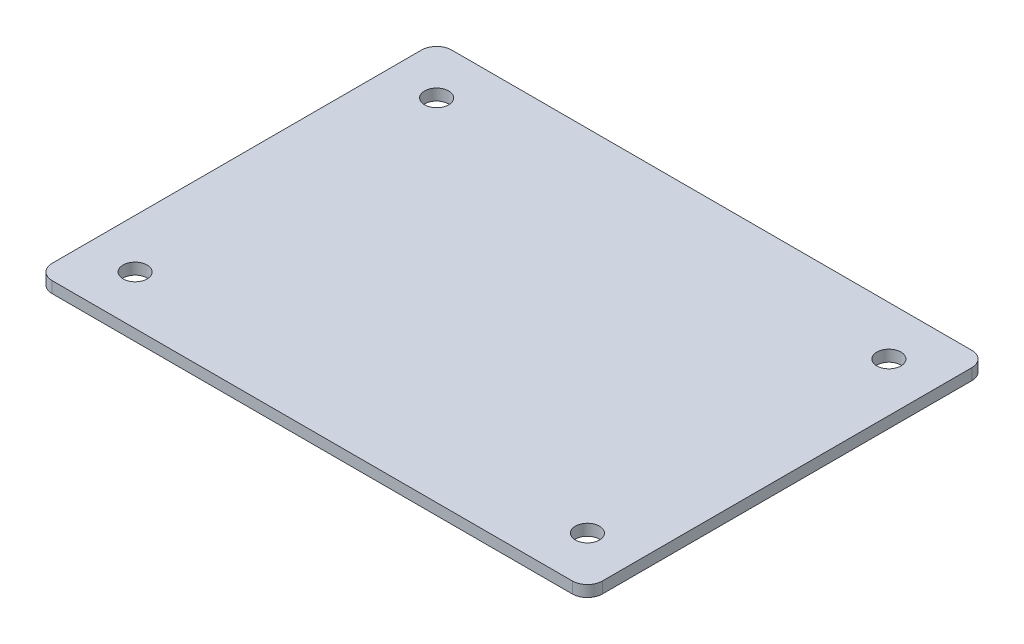
ISO-10303-21;
HEADER;
FILE_DESCRIPTION(('STEP AP214'),'2;1');
FILE_NAME('part.step','',(''),(''),'','','');
FILE_SCHEMA(('AUTOMOTIVE_DESIGN { 1 0 10303 214 1 1 1 1 }'));
ENDSEC;
DATA;
#1=APPLICATION_CONTEXT('core data for automotive mechanical design processes');
#2=APPLICATION_PROTOCOL_DEFINITION('international standard','automotive_design',2000,#1);
#3=PRODUCT_CONTEXT('',#1,'mechanical');
#4=PRODUCT('Part','Part','',(#3));
#5=PRODUCT_RELATED_PRODUCT_CATEGORY('part','',(#4));
#6=PRODUCT_DEFINITION_FORMATION('','',#4);
#7=PRODUCT_DEFINITION_CONTEXT('part definition',#1,'design');
#8=PRODUCT_DEFINITION('design','',#6,#7);
#9=PRODUCT_DEFINITION_SHAPE('','',#8);
#10=(LENGTH_UNIT() NAMED_UNIT(*) SI_UNIT(.MILLI.,.METRE.));
#11=(NAMED_UNIT(*) PLANE_ANGLE_UNIT() SI_UNIT($,.RADIAN.));
#12=(NAMED_UNIT(*) SI_UNIT($,.STERADIAN.) SOLID_ANGLE_UNIT());
#13=UNCERTAINTY_MEASURE_WITH_UNIT(LENGTH_MEASURE(1.E-05),#10,'distance_accuracy_value','');
#14=(GEOMETRIC_REPRESENTATION_CONTEXT(3) GLOBAL_UNCERTAINTY_ASSIGNED_CONTEXT((#13)) GLOBAL_UNIT_ASSIGNED_CONTEXT((#10,
#11,#12)) REPRESENTATION_CONTEXT('',''));
#15=CARTESIAN_POINT('',(0.,0.,0.));
#16=DIRECTION('',(0.,0.,1.));
#17=DIRECTION('',(1.,0.,0.));
#18=AXIS2_PLACEMENT_3D('',#15,#16,#17);
#19=CARTESIAN_POINT('',(30.,0.,20.));
#20=DIRECTION('',(0.,1.,0.));
#21=DIRECTION('',(0.,0.,1.));
#22=AXIS2_PLACEMENT_3D('',#19,#20,#21);
#23=CYLINDRICAL_SURFACE('',#22,1.6);
#24=CARTESIAN_POINT('',(30.,0.,20.));
#25=DIRECTION('',(0.,1.,0.));
#26=DIRECTION('',(0.,0.,1.));
#27=AXIS2_PLACEMENT_3D('',#24,#25,#26);
#28=CIRCLE('',#27,1.6);
#29=CARTESIAN_POINT('',(30.,0.,21.6));
#30=VERTEX_POINT('',#29);
#31=EDGE_CURVE('E42',#30,#30,#28,.T.);
#32=ORIENTED_EDGE('',*,*,#31,.F.);
#33=EDGE_LOOP('',(#32));
#34=FACE_BOUND('',#33,.T.);
#35=CARTESIAN_POINT('',(30.,1.5,20.));
#36=DIRECTION('',(0.,1.,0.));
#37=DIRECTION('',(0.,0.,1.));
#38=AXIS2_PLACEMENT_3D('',#35,#36,#37);
#39=CIRCLE('',#38,1.6);
#40=CARTESIAN_POINT('',(30.,1.5,21.6));
#41=VERTEX_POINT('',#40);
#42=EDGE_CURVE('E11',#41,#41,#39,.T.);
#43=ORIENTED_EDGE('',*,*,#42,.T.);
#44=EDGE_LOOP('',(#43));
#45=FACE_BOUND('',#44,.T.);
#46=ADVANCED_FACE('F35',(#34,#45),#23,.F.);
#47=CARTESIAN_POINT('',(-30.,0.,20.));
#48=DIRECTION('',(0.,1.,0.));
#49=DIRECTION('',(0.,0.,1.));
#50=AXIS2_PLACEMENT_3D('',#47,#48,#49);
#51=CYLINDRICAL_SURFACE('',#50,1.6);
#52=CARTESIAN_POINT('',(-30.,0.,20.));
#53=DIRECTION('',(0.,1.,0.));
#54=DIRECTION('',(0.,0.,1.));
#55=AXIS2_PLACEMENT_3D('',#52,#53,#54);
#56=CIRCLE('',#55,1.6);
#57=CARTESIAN_POINT('',(-30.,0.,21.6));
#58=VERTEX_POINT('',#57);
#59=EDGE_CURVE('E168',#58,#58,#56,.T.);
#60=ORIENTED_EDGE('',*,*,#59,.F.);
#61=EDGE_LOOP('',(#60));
#62=FACE_BOUND('',#61,.T.);
#63=CARTESIAN_POINT('',(-30.,1.5,20.));
#64=DIRECTION('',(0.,1.,0.));
#65=DIRECTION('',(0.,0.,1.));
#66=AXIS2_PLACEMENT_3D('',#63,#64,#65);
#67=CIRCLE('',#66,1.6);
#68=CARTESIAN_POINT('',(-30.,1.5,21.6));
#69=VERTEX_POINT('',#68);
#70=EDGE_CURVE('E171',#69,#69,#67,.T.);
#71=ORIENTED_EDGE('',*,*,#70,.T.);
#72=EDGE_LOOP('',(#71));
#73=FACE_BOUND('',#72,.T.);
#74=ADVANCED_FACE('F179',(#62,#73),#51,.F.);
#75=CARTESIAN_POINT('',(-36.5,1.5,26.5));
#76=DIRECTION('',(1.,0.,0.));
#77=DIRECTION('',(0.,0.,-1.));
#78=AXIS2_PLACEMENT_3D('',#75,#76,#77);
#79=PLANE('',#78);
#80=DIRECTION('',(0.,0.,1.));
#81=VECTOR('',#80,1.);
#82=CARTESIAN_POINT('',(-36.5,1.5,26.5));
#83=LINE('',#82,#81);
#84=CARTESIAN_POINT('',(-36.5,1.5,-24.5));
#85=VERTEX_POINT('',#84);
#86=CARTESIAN_POINT('',(-36.5,1.5,24.5));
#87=VERTEX_POINT('',#86);
#88=EDGE_CURVE('E121',#85,#87,#83,.T.);
#89=ORIENTED_EDGE('',*,*,#88,.F.);
#90=DIRECTION('',(0.,-1.,0.));
#91=VECTOR('',#90,1.);
#92=CARTESIAN_POINT('',(-36.5,1.5,-24.5));
#93=LINE('',#92,#91);
#94=CARTESIAN_POINT('',(-36.5,0.,-24.5));
#95=VERTEX_POINT('',#94);
#96=EDGE_CURVE('E105',#85,#95,#93,.T.);
#97=ORIENTED_EDGE('',*,*,#96,.T.);
#98=DIRECTION('',(0.,0.,1.));
#99=VECTOR('',#98,1.);
#100=CARTESIAN_POINT('',(-36.5,0.,26.5));
#101=LINE('',#100,#99);
#102=CARTESIAN_POINT('',(-36.5,0.,24.5));
#103=VERTEX_POINT('',#102);
#104=EDGE_CURVE('E118',#95,#103,#101,.T.);
#105=ORIENTED_EDGE('',*,*,#104,.T.);
#106=DIRECTION('',(0.,-1.,0.));
#107=VECTOR('',#106,1.);
#108=CARTESIAN_POINT('',(-36.5,1.5,24.5));
#109=LINE('',#108,#107);
#110=EDGE_CURVE('E123',#103,#87,#109,.F.);
#111=ORIENTED_EDGE('',*,*,#110,.T.);
#112=EDGE_LOOP('',(#89,#97,#105,#111));
#113=FACE_BOUND('',#112,.T.);
#114=ADVANCED_FACE('F117',(#113),#79,.F.);
#115=CARTESIAN_POINT('',(36.5,1.5,26.5));
#116=DIRECTION('',(0.,0.,-1.));
#117=DIRECTION('',(-1.,0.,0.));
#118=AXIS2_PLACEMENT_3D('',#115,#116,#117);
#119=PLANE('',#118);
#120=DIRECTION('',(1.,0.,0.));
#121=VECTOR('',#120,1.);
#122=CARTESIAN_POINT('',(36.5,0.,26.5));
#123=LINE('',#122,#121);
#124=CARTESIAN_POINT('',(-34.5,0.,26.5));
#125=VERTEX_POINT('',#124);
#126=CARTESIAN_POINT('',(34.5,0.,26.5));
#127=VERTEX_POINT('',#126);
#128=EDGE_CURVE('E128',#125,#127,#123,.T.);
#129=ORIENTED_EDGE('',*,*,#128,.T.);
#130=DIRECTION('',(0.,-1.,0.));
#131=VECTOR('',#130,1.);
#132=CARTESIAN_POINT('',(34.5,1.5,26.5));
#133=LINE('',#132,#131);
#134=CARTESIAN_POINT('',(34.5,1.5,26.5));
#135=VERTEX_POINT('',#134);
#136=EDGE_CURVE('E166',#127,#135,#133,.F.);
#137=ORIENTED_EDGE('',*,*,#136,.T.);
#138=DIRECTION('',(1.,0.,0.));
#139=VECTOR('',#138,1.);
#140=CARTESIAN_POINT('',(36.5,1.5,26.5));
#141=LINE('',#140,#139);
#142=CARTESIAN_POINT('',(-34.5,1.5,26.5));
#143=VERTEX_POINT('',#142);
#144=EDGE_CURVE('E322',#143,#135,#141,.T.);
#145=ORIENTED_EDGE('',*,*,#144,.F.);
#146=DIRECTION('',(0.,-1.,0.));
#147=VECTOR('',#146,1.);
#148=CARTESIAN_POINT('',(-34.5,1.5,26.5));
#149=LINE('',#148,#147);
#150=EDGE_CURVE('E163',#143,#125,#149,.T.);
#151=ORIENTED_EDGE('',*,*,#150,.T.);
#152=EDGE_LOOP('',(#129,#137,#145,#151));
#153=FACE_BOUND('',#152,.T.);
#154=ADVANCED_FACE('F204',(#153),#119,.F.);
#155=CARTESIAN_POINT('',(36.5,1.5,26.5));
#156=DIRECTION('',(-1.,0.,0.));
#157=DIRECTION('',(0.,0.,1.));
#158=AXIS2_PLACEMENT_3D('',#155,#156,#157);
#159=PLANE('',#158);
#160=DIRECTION('',(0.,0.,-1.));
#161=VECTOR('',#160,1.);
#162=CARTESIAN_POINT('',(36.5,0.,26.5));
#163=LINE('',#162,#161);
#164=CARTESIAN_POINT('',(36.5,0.,24.5));
#165=VERTEX_POINT('',#164);
#166=CARTESIAN_POINT('',(36.5,0.,-24.5));
#167=VERTEX_POINT('',#166);
#168=EDGE_CURVE('E132',#165,#167,#163,.T.);
#169=ORIENTED_EDGE('',*,*,#168,.T.);
#170=DIRECTION('',(0.,-1.,0.));
#171=VECTOR('',#170,1.);
#172=CARTESIAN_POINT('',(36.5,1.5,-24.5));
#173=LINE('',#172,#171);
#174=CARTESIAN_POINT('',(36.5,1.5,-24.5));
#175=VERTEX_POINT('',#174);
#176=EDGE_CURVE('E49',#167,#175,#173,.F.);
#177=ORIENTED_EDGE('',*,*,#176,.T.);
#178=DIRECTION('',(0.,0.,-1.));
#179=VECTOR('',#178,1.);
#180=CARTESIAN_POINT('',(36.5,1.5,26.5));
#181=LINE('',#180,#179);
#182=CARTESIAN_POINT('',(36.5,1.5,24.5));
#183=VERTEX_POINT('',#182);
#184=EDGE_CURVE('E323',#183,#175,#181,.T.);
#185=ORIENTED_EDGE('',*,*,#184,.F.);
#186=DIRECTION('',(0.,-1.,0.));
#187=VECTOR('',#186,1.);
#188=CARTESIAN_POINT('',(36.5,1.5,24.5));
#189=LINE('',#188,#187);
#190=EDGE_CURVE('E159',#183,#165,#189,.T.);
#191=ORIENTED_EDGE('',*,*,#190,.T.);
#192=EDGE_LOOP('',(#169,#177,#185,#191));
#193=FACE_BOUND('',#192,.T.);
#194=ADVANCED_FACE('F193',(#193),#159,.F.);
#195=CARTESIAN_POINT('',(36.5,1.5,-26.5));
#196=DIRECTION('',(0.,0.,1.));
#197=DIRECTION('',(1.,0.,0.));
#198=AXIS2_PLACEMENT_3D('',#195,#196,#197);
#199=PLANE('',#198);
#200=DIRECTION('',(-1.,0.,0.));
#201=VECTOR('',#200,1.);
#202=CARTESIAN_POINT('',(36.5,0.,-26.5));
#203=LINE('',#202,#201);
#204=CARTESIAN_POINT('',(34.5,0.,-26.5));
#205=VERTEX_POINT('',#204);
#206=CARTESIAN_POINT('',(-34.5,0.,-26.5));
#207=VERTEX_POINT('',#206);
#208=EDGE_CURVE('E142',#205,#207,#203,.T.);
#209=ORIENTED_EDGE('',*,*,#208,.T.);
#210=DIRECTION('',(0.,-1.,0.));
#211=VECTOR('',#210,1.);
#212=CARTESIAN_POINT('',(-34.5,1.5,-26.5));
#213=LINE('',#212,#211);
#214=CARTESIAN_POINT('',(-34.5,1.5,-26.5));
#215=VERTEX_POINT('',#214);
#216=EDGE_CURVE('E106',#207,#215,#213,.F.);
#217=ORIENTED_EDGE('',*,*,#216,.T.);
#218=DIRECTION('',(-1.,0.,0.));
#219=VECTOR('',#218,1.);
#220=CARTESIAN_POINT('',(36.5,1.5,-26.5));
#221=LINE('',#220,#219);
#222=CARTESIAN_POINT('',(34.5,1.5,-26.5));
#223=VERTEX_POINT('',#222);
#224=EDGE_CURVE('E138',#223,#215,#221,.T.);
#225=ORIENTED_EDGE('',*,*,#224,.F.);
#226=DIRECTION('',(0.,-1.,0.));
#227=VECTOR('',#226,1.);
#228=CARTESIAN_POINT('',(34.5,1.5,-26.5));
#229=LINE('',#228,#227);
#230=EDGE_CURVE('E111',#223,#205,#229,.T.);
#231=ORIENTED_EDGE('',*,*,#230,.T.);
#232=EDGE_LOOP('',(#209,#217,#225,#231));
#233=FACE_BOUND('',#232,.T.);
#234=ADVANCED_FACE('F184',(#233),#199,.F.);
#235=CARTESIAN_POINT('',(0.,1.5,0.));
#236=DIRECTION('',(0.,1.,0.));
#237=DIRECTION('',(0.,0.,1.));
#238=AXIS2_PLACEMENT_3D('',#235,#236,#237);
#239=PLANE('',#238);
#240=CARTESIAN_POINT('',(30.,1.5,-20.));
#241=DIRECTION('',(0.,1.,0.));
#242=DIRECTION('',(0.,0.,1.));
#243=AXIS2_PLACEMENT_3D('',#240,#241,#242);
#244=CIRCLE('',#243,1.6);
#245=CARTESIAN_POINT('',(30.,1.5,-18.4));
#246=VERTEX_POINT('',#245);
#247=EDGE_CURVE('E315',#246,#246,#244,.T.);
#248=ORIENTED_EDGE('',*,*,#247,.F.);
#249=EDGE_LOOP('',(#248));
#250=FACE_BOUND('',#249,.T.);
#251=CARTESIAN_POINT('',(-30.,1.5,-20.));
#252=DIRECTION('',(0.,1.,0.));
#253=DIRECTION('',(0.,0.,1.));
#254=AXIS2_PLACEMENT_3D('',#251,#252,#253);
#255=CIRCLE('',#254,1.6);
#256=CARTESIAN_POINT('',(-30.,1.5,-18.4));
#257=VERTEX_POINT('',#256);
#258=EDGE_CURVE('E135',#257,#257,#255,.T.);
#259=ORIENTED_EDGE('',*,*,#258,.F.);
#260=EDGE_LOOP('',(#259));
#261=FACE_BOUND('',#260,.T.);
#262=ORIENTED_EDGE('',*,*,#224,.T.);
#263=CARTESIAN_POINT('',(-34.5,1.5,-24.5));
#264=DIRECTION('',(0.,1.,0.));
#265=DIRECTION('',(0.,0.,1.));
#266=AXIS2_PLACEMENT_3D('',#263,#264,#265);
#267=CIRCLE('',#266,2.);
#268=EDGE_CURVE('E157',#215,#85,#267,.T.);
#269=ORIENTED_EDGE('',*,*,#268,.T.);
#270=ORIENTED_EDGE('',*,*,#88,.T.);
#271=CARTESIAN_POINT('',(-34.5,1.5,24.5));
#272=DIRECTION('',(0.,1.,0.));
#273=DIRECTION('',(0.,0.,1.));
#274=AXIS2_PLACEMENT_3D('',#271,#272,#273);
#275=CIRCLE('',#274,2.);
#276=EDGE_CURVE('E152',#87,#143,#275,.T.);
#277=ORIENTED_EDGE('',*,*,#276,.T.);
#278=ORIENTED_EDGE('',*,*,#144,.T.);
#279=CARTESIAN_POINT('',(34.5,1.5,24.5));
#280=DIRECTION('',(0.,1.,0.));
#281=DIRECTION('',(0.,0.,1.));
#282=AXIS2_PLACEMENT_3D('',#279,#280,#281);
#283=CIRCLE('',#282,2.);
#284=EDGE_CURVE('E56',#135,#183,#283,.T.);
#285=ORIENTED_EDGE('',*,*,#284,.T.);
#286=ORIENTED_EDGE('',*,*,#184,.T.);
#287=CARTESIAN_POINT('',(34.5,1.5,-24.5));
#288=DIRECTION('',(0.,1.,0.));
#289=DIRECTION('',(0.,0.,1.));
#290=AXIS2_PLACEMENT_3D('',#287,#288,#289);
#291=CIRCLE('',#290,2.);
#292=EDGE_CURVE('E155',#175,#223,#291,.T.);
#293=ORIENTED_EDGE('',*,*,#292,.T.);
#294=EDGE_LOOP('',(#262,#269,#270,#277,#278,#285,#286,#293));
#295=FACE_BOUND('',#294,.T.);
#296=ORIENTED_EDGE('',*,*,#70,.F.);
#297=EDGE_LOOP('',(#296));
#298=FACE_BOUND('',#297,.T.);
#299=ORIENTED_EDGE('',*,*,#42,.F.);
#300=EDGE_LOOP('',(#299));
#301=FACE_BOUND('',#300,.T.);
#302=ADVANCED_FACE('F182',(#250,#261,#295,#298,#301),#239,.T.);
#303=CARTESIAN_POINT('',(0.,0.,0.));
#304=DIRECTION('',(0.,1.,0.));
#305=DIRECTION('',(0.,0.,1.));
#306=AXIS2_PLACEMENT_3D('',#303,#304,#305);
#307=PLANE('',#306);
#308=CARTESIAN_POINT('',(30.,0.,-20.));
#309=DIRECTION('',(0.,1.,0.));
#310=DIRECTION('',(0.,0.,1.));
#311=AXIS2_PLACEMENT_3D('',#308,#309,#310);
#312=CIRCLE('',#311,1.6);
#313=CARTESIAN_POINT('',(30.,0.,-18.4));
#314=VERTEX_POINT('',#313);
#315=EDGE_CURVE('E313',#314,#314,#312,.T.);
#316=ORIENTED_EDGE('',*,*,#315,.T.);
#317=EDGE_LOOP('',(#316));
#318=FACE_BOUND('',#317,.T.);
#319=CARTESIAN_POINT('',(-30.,0.,-20.));
#320=DIRECTION('',(0.,1.,0.));
#321=DIRECTION('',(0.,0.,1.));
#322=AXIS2_PLACEMENT_3D('',#319,#320,#321);
#323=CIRCLE('',#322,1.6);
#324=CARTESIAN_POINT('',(-30.,0.,-18.4));
#325=VERTEX_POINT('',#324);
#326=EDGE_CURVE('E129',#325,#325,#323,.T.);
#327=ORIENTED_EDGE('',*,*,#326,.T.);
#328=EDGE_LOOP('',(#327));
#329=FACE_BOUND('',#328,.T.);
#330=ORIENTED_EDGE('',*,*,#104,.F.);
#331=CARTESIAN_POINT('',(-34.5,0.,-24.5));
#332=DIRECTION('',(0.,1.,0.));
#333=DIRECTION('',(0.,0.,1.));
#334=AXIS2_PLACEMENT_3D('',#331,#332,#333);
#335=CIRCLE('',#334,2.);
#336=EDGE_CURVE('E101',#95,#207,#335,.F.);
#337=ORIENTED_EDGE('',*,*,#336,.T.);
#338=ORIENTED_EDGE('',*,*,#208,.F.);
#339=CARTESIAN_POINT('',(34.5,0.,-24.5));
#340=DIRECTION('',(0.,1.,0.));
#341=DIRECTION('',(0.,0.,1.));
#342=AXIS2_PLACEMENT_3D('',#339,#340,#341);
#343=CIRCLE('',#342,2.);
#344=EDGE_CURVE('E112',#205,#167,#343,.F.);
#345=ORIENTED_EDGE('',*,*,#344,.T.);
#346=ORIENTED_EDGE('',*,*,#168,.F.);
#347=CARTESIAN_POINT('',(34.5,0.,24.5));
#348=DIRECTION('',(0.,1.,0.));
#349=DIRECTION('',(0.,0.,1.));
#350=AXIS2_PLACEMENT_3D('',#347,#348,#349);
#351=CIRCLE('',#350,2.);
#352=EDGE_CURVE('E146',#165,#127,#351,.F.);
#353=ORIENTED_EDGE('',*,*,#352,.T.);
#354=ORIENTED_EDGE('',*,*,#128,.F.);
#355=CARTESIAN_POINT('',(-34.5,0.,24.5));
#356=DIRECTION('',(0.,1.,0.));
#357=DIRECTION('',(0.,0.,1.));
#358=AXIS2_PLACEMENT_3D('',#355,#356,#357);
#359=CIRCLE('',#358,2.);
#360=EDGE_CURVE('E122',#125,#103,#359,.F.);
#361=ORIENTED_EDGE('',*,*,#360,.T.);
#362=EDGE_LOOP('',(#330,#337,#338,#345,#346,#353,#354,#361));
#363=FACE_BOUND('',#362,.T.);
#364=ORIENTED_EDGE('',*,*,#59,.T.);
#365=EDGE_LOOP('',(#364));
#366=FACE_BOUND('',#365,.T.);
#367=ORIENTED_EDGE('',*,*,#31,.T.);
#368=EDGE_LOOP('',(#367));
#369=FACE_BOUND('',#368,.T.);
#370=ADVANCED_FACE('F125',(#318,#329,#363,#366,#369),#307,.F.);
#371=CARTESIAN_POINT('',(-34.5,1.5,-24.5));
#372=DIRECTION('',(0.,-1.,0.));
#373=DIRECTION('',(0.,0.,-1.));
#374=AXIS2_PLACEMENT_3D('',#371,#372,#373);
#375=CYLINDRICAL_SURFACE('',#374,2.);
#376=ORIENTED_EDGE('',*,*,#268,.F.);
#377=ORIENTED_EDGE('',*,*,#216,.F.);
#378=ORIENTED_EDGE('',*,*,#336,.F.);
#379=ORIENTED_EDGE('',*,*,#96,.F.);
#380=EDGE_LOOP('',(#376,#377,#378,#379));
#381=FACE_BOUND('',#380,.T.);
#382=ADVANCED_FACE('F104',(#381),#375,.T.);
#383=CARTESIAN_POINT('',(34.5,1.5,-24.5));
#384=DIRECTION('',(0.,-1.,0.));
#385=DIRECTION('',(0.,0.,-1.));
#386=AXIS2_PLACEMENT_3D('',#383,#384,#385);
#387=CYLINDRICAL_SURFACE('',#386,2.);
#388=ORIENTED_EDGE('',*,*,#292,.F.);
#389=ORIENTED_EDGE('',*,*,#176,.F.);
#390=ORIENTED_EDGE('',*,*,#344,.F.);
#391=ORIENTED_EDGE('',*,*,#230,.F.);
#392=EDGE_LOOP('',(#388,#389,#390,#391));
#393=FACE_BOUND('',#392,.T.);
#394=ADVANCED_FACE('F212',(#393),#387,.T.);
#395=CARTESIAN_POINT('',(34.5,1.5,24.5));
#396=DIRECTION('',(0.,-1.,0.));
#397=DIRECTION('',(0.,0.,-1.));
#398=AXIS2_PLACEMENT_3D('',#395,#396,#397);
#399=CYLINDRICAL_SURFACE('',#398,2.);
#400=ORIENTED_EDGE('',*,*,#284,.F.);
#401=ORIENTED_EDGE('',*,*,#136,.F.);
#402=ORIENTED_EDGE('',*,*,#352,.F.);
#403=ORIENTED_EDGE('',*,*,#190,.F.);
#404=EDGE_LOOP('',(#400,#401,#402,#403));
#405=FACE_BOUND('',#404,.T.);
#406=ADVANCED_FACE('F215',(#405),#399,.T.);
#407=CARTESIAN_POINT('',(-34.5,1.5,24.5));
#408=DIRECTION('',(0.,-1.,0.));
#409=DIRECTION('',(0.,0.,-1.));
#410=AXIS2_PLACEMENT_3D('',#407,#408,#409);
#411=CYLINDRICAL_SURFACE('',#410,2.);
#412=ORIENTED_EDGE('',*,*,#276,.F.);
#413=ORIENTED_EDGE('',*,*,#110,.F.);
#414=ORIENTED_EDGE('',*,*,#360,.F.);
#415=ORIENTED_EDGE('',*,*,#150,.F.);
#416=EDGE_LOOP('',(#412,#413,#414,#415));
#417=FACE_BOUND('',#416,.T.);
#418=ADVANCED_FACE('F219',(#417),#411,.T.);
#419=CARTESIAN_POINT('',(-30.,0.,-20.));
#420=DIRECTION('',(0.,1.,0.));
#421=DIRECTION('',(0.,0.,1.));
#422=AXIS2_PLACEMENT_3D('',#419,#420,#421);
#423=CYLINDRICAL_SURFACE('',#422,1.6);
#424=ORIENTED_EDGE('',*,*,#326,.F.);
#425=EDGE_LOOP('',(#424));
#426=FACE_BOUND('',#425,.T.);
#427=ORIENTED_EDGE('',*,*,#258,.T.);
#428=EDGE_LOOP('',(#427));
#429=FACE_BOUND('',#428,.T.);
#430=ADVANCED_FACE('F199',(#426,#429),#423,.F.);
#431=CARTESIAN_POINT('',(30.,0.,-20.));
#432=DIRECTION('',(0.,1.,0.));
#433=DIRECTION('',(0.,0.,1.));
#434=AXIS2_PLACEMENT_3D('',#431,#432,#433);
#435=CYLINDRICAL_SURFACE('',#434,1.6);
#436=ORIENTED_EDGE('',*,*,#315,.F.);
#437=EDGE_LOOP('',(#436));
#438=FACE_BOUND('',#437,.T.);
#439=ORIENTED_EDGE('',*,*,#247,.T.);
#440=EDGE_LOOP('',(#439));
#441=FACE_BOUND('',#440,.T.);
#442=ADVANCED_FACE('F283',(#438,#441),#435,.F.);
#443=CLOSED_SHELL('',(#46,#74,#114,#154,#194,#234,#302,#370,#382,#394,#406,#418,#430,#442));
#444=MANIFOLD_SOLID_BREP('B2',#443);
#445=ADVANCED_BREP_SHAPE_REPRESENTATION('',(#18,#444),#14);
#446=SHAPE_DEFINITION_REPRESENTATION(#9,#445);
ENDSEC;
END-ISO-10303-21;
